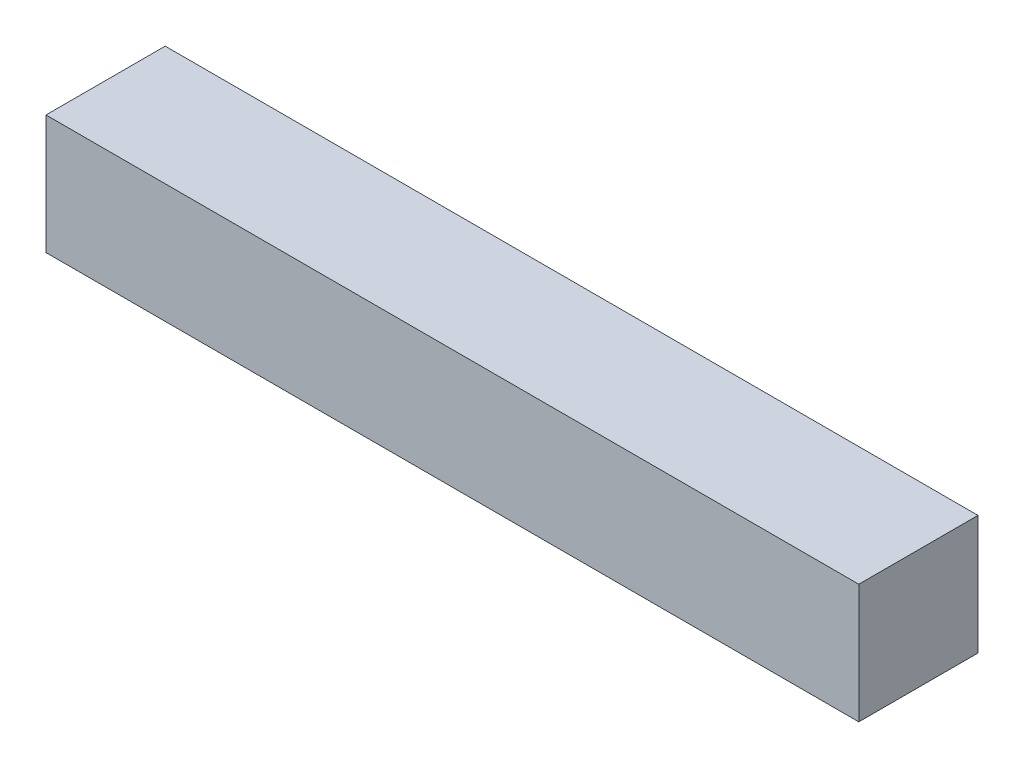
ISO-10303-21;
HEADER;
FILE_DESCRIPTION(('STEP AP214'),'2;1');
FILE_NAME('part.step','',(''),(''),'','','');
FILE_SCHEMA(('AUTOMOTIVE_DESIGN { 1 0 10303 214 1 1 1 1 }'));
ENDSEC;
DATA;
#1=APPLICATION_CONTEXT('core data for automotive mechanical design processes');
#2=APPLICATION_PROTOCOL_DEFINITION('international standard','automotive_design',2000,#1);
#3=PRODUCT_CONTEXT('',#1,'mechanical');
#4=PRODUCT('Part','Part','',(#3));
#5=PRODUCT_RELATED_PRODUCT_CATEGORY('part','',(#4));
#6=PRODUCT_DEFINITION_FORMATION('','',#4);
#7=PRODUCT_DEFINITION_CONTEXT('part definition',#1,'design');
#8=PRODUCT_DEFINITION('design','',#6,#7);
#9=PRODUCT_DEFINITION_SHAPE('','',#8);
#10=(LENGTH_UNIT() NAMED_UNIT(*) SI_UNIT(.MILLI.,.METRE.));
#11=(NAMED_UNIT(*) PLANE_ANGLE_UNIT() SI_UNIT($,.RADIAN.));
#12=(NAMED_UNIT(*) SI_UNIT($,.STERADIAN.) SOLID_ANGLE_UNIT());
#13=UNCERTAINTY_MEASURE_WITH_UNIT(LENGTH_MEASURE(1.E-05),#10,'distance_accuracy_value','');
#14=(GEOMETRIC_REPRESENTATION_CONTEXT(3) GLOBAL_UNCERTAINTY_ASSIGNED_CONTEXT((#13)) GLOBAL_UNIT_ASSIGNED_CONTEXT((#10,
#11,#12)) REPRESENTATION_CONTEXT('',''));
#15=CARTESIAN_POINT('',(0.,0.,0.));
#16=DIRECTION('',(0.,0.,1.));
#17=DIRECTION('',(1.,0.,0.));
#18=AXIS2_PLACEMENT_3D('',#15,#16,#17);
#19=CARTESIAN_POINT('',(75.,0.,11.));
#20=DIRECTION('',(1.,0.,0.));
#21=DIRECTION('',(0.,1.,0.));
#22=AXIS2_PLACEMENT_3D('',#19,#20,#21);
#23=PLANE('',#22);
#24=DIRECTION('',(0.,0.,1.));
#25=VECTOR('',#24,1.);
#26=CARTESIAN_POINT('',(75.,0.,-11.));
#27=LINE('',#26,#25);
#28=CARTESIAN_POINT('',(75.,0.,-11.));
#29=VERTEX_POINT('',#28);
#30=CARTESIAN_POINT('',(75.,0.,11.));
#31=VERTEX_POINT('',#30);
#32=EDGE_CURVE('E38',#29,#31,#27,.T.);
#33=ORIENTED_EDGE('',*,*,#32,.F.);
#34=DIRECTION('',(0.,1.,0.));
#35=VECTOR('',#34,1.);
#36=CARTESIAN_POINT('',(75.,0.,-11.));
#37=LINE('',#36,#35);
#38=CARTESIAN_POINT('',(75.,22.,-11.));
#39=VERTEX_POINT('',#38);
#40=EDGE_CURVE('E11',#29,#39,#37,.T.);
#41=ORIENTED_EDGE('',*,*,#40,.T.);
#42=DIRECTION('',(0.,0.,-1.));
#43=VECTOR('',#42,1.);
#44=CARTESIAN_POINT('',(75.,22.,-11.));
#45=LINE('',#44,#43);
#46=CARTESIAN_POINT('',(75.,22.,11.));
#47=VERTEX_POINT('',#46);
#48=EDGE_CURVE('E51',#47,#39,#45,.T.);
#49=ORIENTED_EDGE('',*,*,#48,.F.);
#50=DIRECTION('',(0.,1.,0.));
#51=VECTOR('',#50,1.);
#52=CARTESIAN_POINT('',(75.,0.,11.));
#53=LINE('',#52,#51);
#54=EDGE_CURVE('E26',#31,#47,#53,.T.);
#55=ORIENTED_EDGE('',*,*,#54,.F.);
#56=EDGE_LOOP('',(#33,#41,#49,#55));
#57=FACE_BOUND('',#56,.T.);
#58=ADVANCED_FACE('F16',(#57),#23,.T.);
#59=CARTESIAN_POINT('',(-75.,0.,11.));
#60=DIRECTION('',(0.,0.,1.));
#61=DIRECTION('',(1.,0.,0.));
#62=AXIS2_PLACEMENT_3D('',#59,#60,#61);
#63=PLANE('',#62);
#64=DIRECTION('',(-1.,0.,0.));
#65=VECTOR('',#64,1.);
#66=CARTESIAN_POINT('',(75.,0.,11.));
#67=LINE('',#66,#65);
#68=CARTESIAN_POINT('',(-75.,0.,11.));
#69=VERTEX_POINT('',#68);
#70=EDGE_CURVE('E101',#31,#69,#67,.T.);
#71=ORIENTED_EDGE('',*,*,#70,.F.);
#72=ORIENTED_EDGE('',*,*,#54,.T.);
#73=DIRECTION('',(1.,0.,0.));
#74=VECTOR('',#73,1.);
#75=CARTESIAN_POINT('',(75.,22.,11.));
#76=LINE('',#75,#74);
#77=CARTESIAN_POINT('',(-75.,22.,11.));
#78=VERTEX_POINT('',#77);
#79=EDGE_CURVE('E84',#78,#47,#76,.T.);
#80=ORIENTED_EDGE('',*,*,#79,.F.);
#81=DIRECTION('',(0.,1.,0.));
#82=VECTOR('',#81,1.);
#83=CARTESIAN_POINT('',(-75.,0.,11.));
#84=LINE('',#83,#82);
#85=EDGE_CURVE('E81',#69,#78,#84,.T.);
#86=ORIENTED_EDGE('',*,*,#85,.F.);
#87=EDGE_LOOP('',(#71,#72,#80,#86));
#88=FACE_BOUND('',#87,.T.);
#89=ADVANCED_FACE('F161',(#88),#63,.T.);
#90=CARTESIAN_POINT('',(-75.,0.,-11.));
#91=DIRECTION('',(-1.,0.,0.));
#92=DIRECTION('',(0.,0.,1.));
#93=AXIS2_PLACEMENT_3D('',#90,#91,#92);
#94=PLANE('',#93);
#95=DIRECTION('',(0.,0.,-1.));
#96=VECTOR('',#95,1.);
#97=CARTESIAN_POINT('',(-75.,0.,11.));
#98=LINE('',#97,#96);
#99=CARTESIAN_POINT('',(-75.,0.,-11.));
#100=VERTEX_POINT('',#99);
#101=EDGE_CURVE('E99',#69,#100,#98,.T.);
#102=ORIENTED_EDGE('',*,*,#101,.F.);
#103=ORIENTED_EDGE('',*,*,#85,.T.);
#104=DIRECTION('',(0.,0.,1.));
#105=VECTOR('',#104,1.);
#106=CARTESIAN_POINT('',(-75.,22.,11.));
#107=LINE('',#106,#105);
#108=CARTESIAN_POINT('',(-75.,22.,-11.));
#109=VERTEX_POINT('',#108);
#110=EDGE_CURVE('E20',#109,#78,#107,.T.);
#111=ORIENTED_EDGE('',*,*,#110,.F.);
#112=DIRECTION('',(0.,1.,0.));
#113=VECTOR('',#112,1.);
#114=CARTESIAN_POINT('',(-75.,0.,-11.));
#115=LINE('',#114,#113);
#116=EDGE_CURVE('E78',#100,#109,#115,.T.);
#117=ORIENTED_EDGE('',*,*,#116,.F.);
#118=EDGE_LOOP('',(#102,#103,#111,#117));
#119=FACE_BOUND('',#118,.T.);
#120=ADVANCED_FACE('F77',(#119),#94,.T.);
#121=CARTESIAN_POINT('',(75.,0.,-11.));
#122=DIRECTION('',(0.,0.,-1.));
#123=DIRECTION('',(0.,-1.,0.));
#124=AXIS2_PLACEMENT_3D('',#121,#122,#123);
#125=PLANE('',#124);
#126=DIRECTION('',(1.,0.,0.));
#127=VECTOR('',#126,1.);
#128=CARTESIAN_POINT('',(-75.,0.,-11.));
#129=LINE('',#128,#127);
#130=EDGE_CURVE('E89',#100,#29,#129,.T.);
#131=ORIENTED_EDGE('',*,*,#130,.F.);
#132=ORIENTED_EDGE('',*,*,#116,.T.);
#133=DIRECTION('',(-1.,0.,0.));
#134=VECTOR('',#133,1.);
#135=CARTESIAN_POINT('',(-75.,22.,-11.));
#136=LINE('',#135,#134);
#137=EDGE_CURVE('E83',#39,#109,#136,.T.);
#138=ORIENTED_EDGE('',*,*,#137,.F.);
#139=ORIENTED_EDGE('',*,*,#40,.F.);
#140=EDGE_LOOP('',(#131,#132,#138,#139));
#141=FACE_BOUND('',#140,.T.);
#142=ADVANCED_FACE('F87',(#141),#125,.T.);
#143=CARTESIAN_POINT('',(0.,22.,0.));
#144=DIRECTION('',(0.,1.,0.));
#145=DIRECTION('',(1.,0.,0.));
#146=AXIS2_PLACEMENT_3D('',#143,#144,#145);
#147=PLANE('',#146);
#148=ORIENTED_EDGE('',*,*,#137,.T.);
#149=ORIENTED_EDGE('',*,*,#110,.T.);
#150=ORIENTED_EDGE('',*,*,#79,.T.);
#151=ORIENTED_EDGE('',*,*,#48,.T.);
#152=EDGE_LOOP('',(#148,#149,#150,#151));
#153=FACE_BOUND('',#152,.T.);
#154=ADVANCED_FACE('F92',(#153),#147,.T.);
#155=CARTESIAN_POINT('',(0.,0.,0.));
#156=DIRECTION('',(0.,1.,0.));
#157=DIRECTION('',(1.,0.,0.));
#158=AXIS2_PLACEMENT_3D('',#155,#156,#157);
#159=PLANE('',#158);
#160=ORIENTED_EDGE('',*,*,#130,.T.);
#161=ORIENTED_EDGE('',*,*,#32,.T.);
#162=ORIENTED_EDGE('',*,*,#70,.T.);
#163=ORIENTED_EDGE('',*,*,#101,.T.);
#164=EDGE_LOOP('',(#160,#161,#162,#163));
#165=FACE_BOUND('',#164,.T.);
#166=ADVANCED_FACE('F18',(#165),#159,.F.);
#167=CLOSED_SHELL('',(#58,#89,#120,#142,#154,#166));
#168=MANIFOLD_SOLID_BREP('B1',#167);
#169=ADVANCED_BREP_SHAPE_REPRESENTATION('',(#18,#168),#14);
#170=SHAPE_DEFINITION_REPRESENTATION(#9,#169);
ENDSEC;
END-ISO-10303-21;
